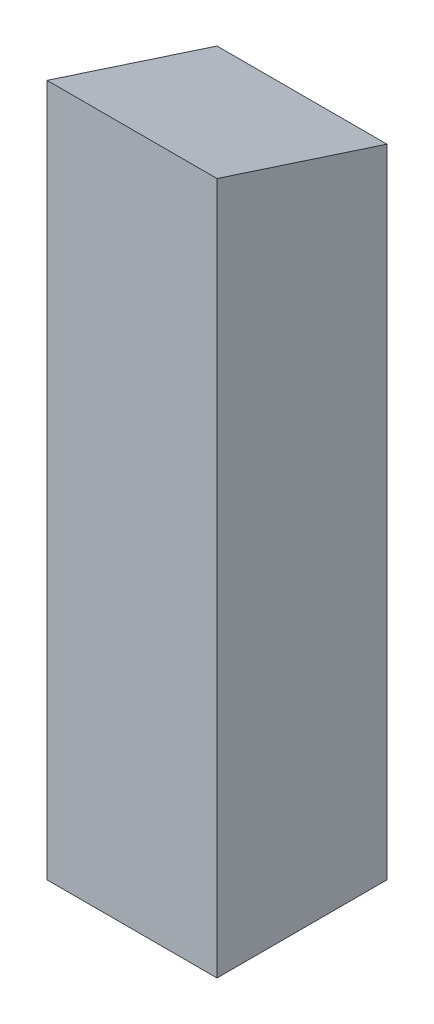
ISO-10303-21;
HEADER;
FILE_DESCRIPTION(('STEP AP214'),'2;1');
FILE_NAME('part.step','',(''),(''),'','','');
FILE_SCHEMA(('AUTOMOTIVE_DESIGN { 1 0 10303 214 1 1 1 1 }'));
ENDSEC;
DATA;
#1=APPLICATION_CONTEXT('core data for automotive mechanical design processes');
#2=APPLICATION_PROTOCOL_DEFINITION('international standard','automotive_design',2000,#1);
#3=PRODUCT_CONTEXT('',#1,'mechanical');
#4=PRODUCT('Part','Part','',(#3));
#5=PRODUCT_RELATED_PRODUCT_CATEGORY('part','',(#4));
#6=PRODUCT_DEFINITION_FORMATION('','',#4);
#7=PRODUCT_DEFINITION_CONTEXT('part definition',#1,'design');
#8=PRODUCT_DEFINITION('design','',#6,#7);
#9=PRODUCT_DEFINITION_SHAPE('','',#8);
#10=(LENGTH_UNIT() NAMED_UNIT(*) SI_UNIT(.MILLI.,.METRE.));
#11=(NAMED_UNIT(*) PLANE_ANGLE_UNIT() SI_UNIT($,.RADIAN.));
#12=(NAMED_UNIT(*) SI_UNIT($,.STERADIAN.) SOLID_ANGLE_UNIT());
#13=UNCERTAINTY_MEASURE_WITH_UNIT(LENGTH_MEASURE(1.E-05),#10,'distance_accuracy_value','');
#14=(GEOMETRIC_REPRESENTATION_CONTEXT(3) GLOBAL_UNCERTAINTY_ASSIGNED_CONTEXT((#13)) GLOBAL_UNIT_ASSIGNED_CONTEXT((#10,
#11,#12)) REPRESENTATION_CONTEXT('',''));
#15=CARTESIAN_POINT('',(0.,0.,0.));
#16=DIRECTION('',(0.,0.,1.));
#17=DIRECTION('',(1.,0.,0.));
#18=AXIS2_PLACEMENT_3D('',#15,#16,#17);
#19=CARTESIAN_POINT('',(19.05,0.,0.));
#20=DIRECTION('',(0.,0.,1.));
#21=DIRECTION('',(1.,0.,0.));
#22=AXIS2_PLACEMENT_3D('',#19,#20,#21);
#23=PLANE('',#22);
#24=DIRECTION('',(0.,1.,0.));
#25=VECTOR('',#24,1.);
#26=CARTESIAN_POINT('',(0.,0.,0.));
#27=LINE('',#26,#25);
#28=CARTESIAN_POINT('',(0.,-3.175,0.));
#29=VERTEX_POINT('',#28);
#30=CARTESIAN_POINT('',(0.,74.4014202132367,0.));
#31=VERTEX_POINT('',#30);
#32=EDGE_CURVE('E110',#29,#31,#27,.T.);
#33=ORIENTED_EDGE('',*,*,#32,.F.);
#34=DIRECTION('',(-1.,0.,0.));
#35=VECTOR('',#34,1.);
#36=CARTESIAN_POINT('',(19.05,-3.175,0.));
#37=LINE('',#36,#35);
#38=CARTESIAN_POINT('',(19.05,-3.175,0.));
#39=VERTEX_POINT('',#38);
#40=EDGE_CURVE('E113',#39,#29,#37,.T.);
#41=ORIENTED_EDGE('',*,*,#40,.F.);
#42=DIRECTION('',(0.,1.,0.));
#43=VECTOR('',#42,1.);
#44=CARTESIAN_POINT('',(19.05,0.,0.));
#45=LINE('',#44,#43);
#46=CARTESIAN_POINT('',(19.05,74.4014202132367,0.));
#47=VERTEX_POINT('',#46);
#48=EDGE_CURVE('E136',#39,#47,#45,.T.);
#49=ORIENTED_EDGE('',*,*,#48,.T.);
#50=DIRECTION('',(-1.,0.,0.));
#51=VECTOR('',#50,1.);
#52=CARTESIAN_POINT('',(19.05,74.4014202132367,0.));
#53=LINE('',#52,#51);
#54=EDGE_CURVE('E76',#47,#31,#53,.T.);
#55=ORIENTED_EDGE('',*,*,#54,.T.);
#56=EDGE_LOOP('',(#33,#41,#49,#55));
#57=FACE_BOUND('',#56,.T.);
#58=ADVANCED_FACE('F65',(#57),#23,.T.);
#59=CARTESIAN_POINT('',(19.05,0.,-19.05));
#60=DIRECTION('',(0.,0.,1.));
#61=DIRECTION('',(1.,0.,0.));
#62=AXIS2_PLACEMENT_3D('',#59,#60,#61);
#63=PLANE('',#62);
#64=DIRECTION('',(0.,1.,0.));
#65=VECTOR('',#64,1.);
#66=CARTESIAN_POINT('',(0.,0.,-19.05));
#67=LINE('',#66,#65);
#68=CARTESIAN_POINT('',(0.,-3.175,-19.05));
#69=VERTEX_POINT('',#68);
#70=CARTESIAN_POINT('',(0.,68.2117,-19.05));
#71=VERTEX_POINT('',#70);
#72=EDGE_CURVE('E104',#69,#71,#67,.T.);
#73=ORIENTED_EDGE('',*,*,#72,.T.);
#74=DIRECTION('',(-1.,0.,0.));
#75=VECTOR('',#74,1.);
#76=CARTESIAN_POINT('',(19.05,68.2117,-19.05));
#77=LINE('',#76,#75);
#78=CARTESIAN_POINT('',(19.05,68.2117,-19.05));
#79=VERTEX_POINT('',#78);
#80=EDGE_CURVE('E12',#79,#71,#77,.T.);
#81=ORIENTED_EDGE('',*,*,#80,.F.);
#82=DIRECTION('',(0.,1.,0.));
#83=VECTOR('',#82,1.);
#84=CARTESIAN_POINT('',(19.05,0.,-19.05));
#85=LINE('',#84,#83);
#86=CARTESIAN_POINT('',(19.05,-3.175,-19.05));
#87=VERTEX_POINT('',#86);
#88=EDGE_CURVE('E141',#87,#79,#85,.T.);
#89=ORIENTED_EDGE('',*,*,#88,.F.);
#90=DIRECTION('',(-1.,0.,0.));
#91=VECTOR('',#90,1.);
#92=CARTESIAN_POINT('',(19.05,-3.175,-19.05));
#93=LINE('',#92,#91);
#94=EDGE_CURVE('E69',#87,#69,#93,.T.);
#95=ORIENTED_EDGE('',*,*,#94,.T.);
#96=EDGE_LOOP('',(#73,#81,#89,#95));
#97=FACE_BOUND('',#96,.T.);
#98=ADVANCED_FACE('F149',(#97),#63,.F.);
#99=CARTESIAN_POINT('',(19.05,67.2967167856888,-21.8660287754774));
#100=DIRECTION('',(0.,-0.951056516295156,0.309016994374941));
#101=DIRECTION('',(0.,-0.309016994374941,-0.951056516295156));
#102=AXIS2_PLACEMENT_3D('',#99,#100,#101);
#103=PLANE('',#102);
#104=DIRECTION('',(0.,0.309016994374941,0.951056516295156));
#105=VECTOR('',#104,1.);
#106=CARTESIAN_POINT('',(0.,67.2967167856888,-21.8660287754774));
#107=LINE('',#106,#105);
#108=EDGE_CURVE('E133',#71,#31,#107,.T.);
#109=ORIENTED_EDGE('',*,*,#108,.T.);
#110=ORIENTED_EDGE('',*,*,#54,.F.);
#111=DIRECTION('',(0.,0.309016994374941,0.951056516295156));
#112=VECTOR('',#111,1.);
#113=CARTESIAN_POINT('',(19.05,67.2967167856888,-21.8660287754774));
#114=LINE('',#113,#112);
#115=EDGE_CURVE('E85',#79,#47,#114,.T.);
#116=ORIENTED_EDGE('',*,*,#115,.F.);
#117=ORIENTED_EDGE('',*,*,#80,.T.);
#118=EDGE_LOOP('',(#109,#110,#116,#117));
#119=FACE_BOUND('',#118,.T.);
#120=ADVANCED_FACE('F151',(#119),#103,.F.);
#121=CARTESIAN_POINT('',(19.05,0.,0.));
#122=DIRECTION('',(1.,0.,0.));
#123=DIRECTION('',(0.,0.,-1.));
#124=AXIS2_PLACEMENT_3D('',#121,#122,#123);
#125=PLANE('',#124);
#126=ORIENTED_EDGE('',*,*,#48,.F.);
#127=DIRECTION('',(0.,0.,-1.));
#128=VECTOR('',#127,1.);
#129=CARTESIAN_POINT('',(19.05,-3.175,0.));
#130=LINE('',#129,#128);
#131=EDGE_CURVE('E123',#39,#87,#130,.T.);
#132=ORIENTED_EDGE('',*,*,#131,.T.);
#133=ORIENTED_EDGE('',*,*,#88,.T.);
#134=ORIENTED_EDGE('',*,*,#115,.T.);
#135=EDGE_LOOP('',(#126,#132,#133,#134));
#136=FACE_BOUND('',#135,.T.);
#137=ADVANCED_FACE('F145',(#136),#125,.T.);
#138=CARTESIAN_POINT('',(0.,0.,0.));
#139=DIRECTION('',(1.,0.,0.));
#140=DIRECTION('',(0.,0.,-1.));
#141=AXIS2_PLACEMENT_3D('',#138,#139,#140);
#142=PLANE('',#141);
#143=ORIENTED_EDGE('',*,*,#32,.T.);
#144=ORIENTED_EDGE('',*,*,#108,.F.);
#145=ORIENTED_EDGE('',*,*,#72,.F.);
#146=DIRECTION('',(0.,0.,-1.));
#147=VECTOR('',#146,1.);
#148=CARTESIAN_POINT('',(0.,-3.175,0.));
#149=LINE('',#148,#147);
#150=EDGE_CURVE('E121',#29,#69,#149,.T.);
#151=ORIENTED_EDGE('',*,*,#150,.F.);
#152=EDGE_LOOP('',(#143,#144,#145,#151));
#153=FACE_BOUND('',#152,.T.);
#154=ADVANCED_FACE('F125',(#153),#142,.F.);
#155=CARTESIAN_POINT('',(19.05,-3.175,0.));
#156=DIRECTION('',(0.,1.,0.));
#157=DIRECTION('',(0.,0.,1.));
#158=AXIS2_PLACEMENT_3D('',#155,#156,#157);
#159=PLANE('',#158);
#160=ORIENTED_EDGE('',*,*,#150,.T.);
#161=ORIENTED_EDGE('',*,*,#94,.F.);
#162=ORIENTED_EDGE('',*,*,#131,.F.);
#163=ORIENTED_EDGE('',*,*,#40,.T.);
#164=EDGE_LOOP('',(#160,#161,#162,#163));
#165=FACE_BOUND('',#164,.T.);
#166=ADVANCED_FACE('F67',(#165),#159,.F.);
#167=CLOSED_SHELL('',(#58,#98,#120,#137,#154,#166));
#168=MANIFOLD_SOLID_BREP('B2',#167);
#169=ADVANCED_BREP_SHAPE_REPRESENTATION('',(#18,#168),#14);
#170=SHAPE_DEFINITION_REPRESENTATION(#9,#169);
ENDSEC;
END-ISO-10303-21;
